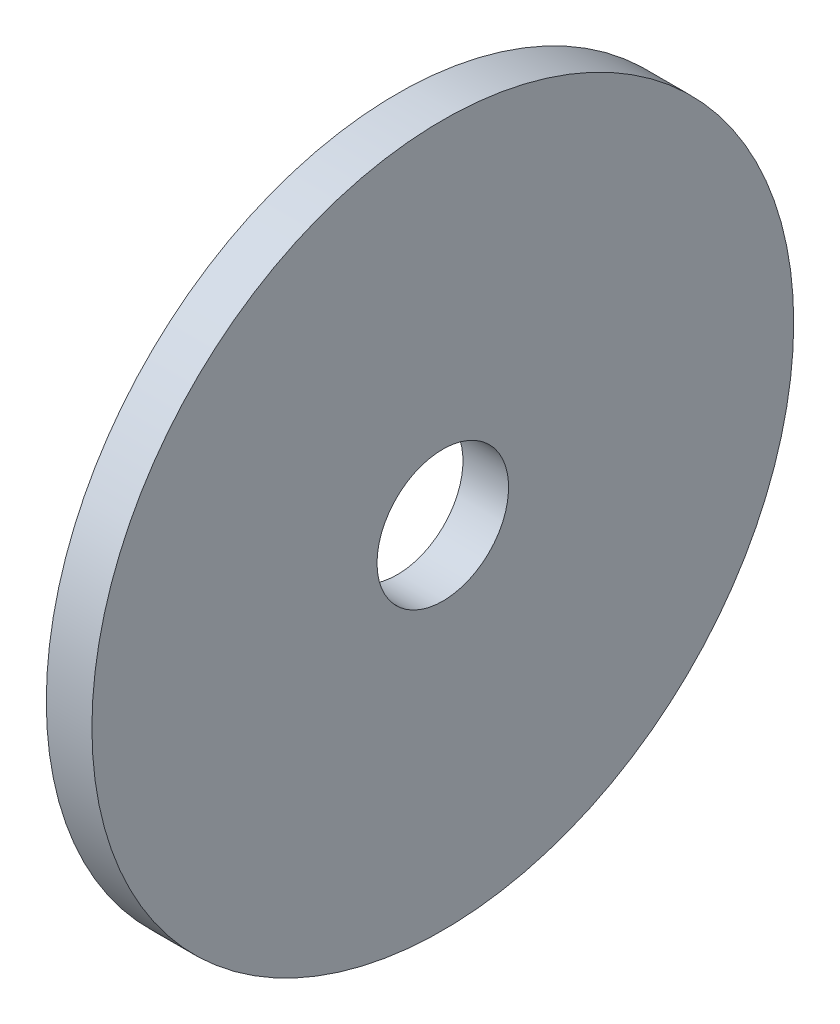
ISO-10303-21;
HEADER;
FILE_DESCRIPTION(('STEP AP214'),'2;1');
FILE_NAME('part.step','',(''),(''),'','','');
FILE_SCHEMA(('AUTOMOTIVE_DESIGN { 1 0 10303 214 1 1 1 1 }'));
ENDSEC;
DATA;
#1=APPLICATION_CONTEXT('core data for automotive mechanical design processes');
#2=APPLICATION_PROTOCOL_DEFINITION('international standard','automotive_design',2000,#1);
#3=PRODUCT_CONTEXT('',#1,'mechanical');
#4=PRODUCT('Part','Part','',(#3));
#5=PRODUCT_RELATED_PRODUCT_CATEGORY('part','',(#4));
#6=PRODUCT_DEFINITION_FORMATION('','',#4);
#7=PRODUCT_DEFINITION_CONTEXT('part definition',#1,'design');
#8=PRODUCT_DEFINITION('design','',#6,#7);
#9=PRODUCT_DEFINITION_SHAPE('','',#8);
#10=(LENGTH_UNIT() NAMED_UNIT(*) SI_UNIT(.MILLI.,.METRE.));
#11=(NAMED_UNIT(*) PLANE_ANGLE_UNIT() SI_UNIT($,.RADIAN.));
#12=(NAMED_UNIT(*) SI_UNIT($,.STERADIAN.) SOLID_ANGLE_UNIT());
#13=UNCERTAINTY_MEASURE_WITH_UNIT(LENGTH_MEASURE(1.E-05),#10,'distance_accuracy_value','');
#14=(GEOMETRIC_REPRESENTATION_CONTEXT(3) GLOBAL_UNCERTAINTY_ASSIGNED_CONTEXT((#13)) GLOBAL_UNIT_ASSIGNED_CONTEXT((#10,
#11,#12)) REPRESENTATION_CONTEXT('',''));
#15=CARTESIAN_POINT('',(0.,0.,0.));
#16=DIRECTION('',(0.,0.,1.));
#17=DIRECTION('',(1.,0.,0.));
#18=AXIS2_PLACEMENT_3D('',#15,#16,#17);
#19=CARTESIAN_POINT('',(1.651,0.,0.));
#20=DIRECTION('',(1.,0.,0.));
#21=DIRECTION('',(0.,0.,-1.));
#22=AXIS2_PLACEMENT_3D('',#19,#20,#21);
#23=PLANE('',#22);
#24=CARTESIAN_POINT('',(1.651,0.,0.));
#25=DIRECTION('',(1.,0.,0.));
#26=DIRECTION('',(0.,0.,-1.));
#27=AXIS2_PLACEMENT_3D('',#24,#25,#26);
#28=CIRCLE('',#27,12.7);
#29=CARTESIAN_POINT('',(1.651,0.,12.7));
#30=VERTEX_POINT('',#29);
#31=EDGE_CURVE('E10',#30,#30,#28,.T.);
#32=ORIENTED_EDGE('',*,*,#31,.T.);
#33=EDGE_LOOP('',(#32));
#34=FACE_BOUND('',#33,.T.);
#35=CARTESIAN_POINT('',(1.651,0.,0.));
#36=DIRECTION('',(1.,0.,0.));
#37=DIRECTION('',(0.,0.,-1.));
#38=AXIS2_PLACEMENT_3D('',#35,#36,#37);
#39=CIRCLE('',#38,2.38125);
#40=CARTESIAN_POINT('',(1.651,0.,2.38125));
#41=VERTEX_POINT('',#40);
#42=EDGE_CURVE('E41',#41,#41,#39,.T.);
#43=ORIENTED_EDGE('',*,*,#42,.F.);
#44=EDGE_LOOP('',(#43));
#45=FACE_BOUND('',#44,.T.);
#46=ADVANCED_FACE('F30',(#34,#45),#23,.T.);
#47=CARTESIAN_POINT('',(0.,0.,0.));
#48=DIRECTION('',(1.,0.,0.));
#49=DIRECTION('',(0.,0.,-1.));
#50=AXIS2_PLACEMENT_3D('',#47,#48,#49);
#51=PLANE('',#50);
#52=CARTESIAN_POINT('',(0.,0.,0.));
#53=DIRECTION('',(1.,0.,0.));
#54=DIRECTION('',(0.,0.,-1.));
#55=AXIS2_PLACEMENT_3D('',#52,#53,#54);
#56=CIRCLE('',#55,12.7);
#57=CARTESIAN_POINT('',(0.,0.,12.7));
#58=VERTEX_POINT('',#57);
#59=EDGE_CURVE('E34',#58,#58,#56,.T.);
#60=ORIENTED_EDGE('',*,*,#59,.F.);
#61=EDGE_LOOP('',(#60));
#62=FACE_BOUND('',#61,.T.);
#63=CARTESIAN_POINT('',(0.,0.,0.));
#64=DIRECTION('',(1.,0.,0.));
#65=DIRECTION('',(0.,0.,-1.));
#66=AXIS2_PLACEMENT_3D('',#63,#64,#65);
#67=CIRCLE('',#66,2.38125);
#68=CARTESIAN_POINT('',(0.,0.,2.38125));
#69=VERTEX_POINT('',#68);
#70=EDGE_CURVE('E43',#69,#69,#67,.T.);
#71=ORIENTED_EDGE('',*,*,#70,.T.);
#72=EDGE_LOOP('',(#71));
#73=FACE_BOUND('',#72,.T.);
#74=ADVANCED_FACE('F53',(#62,#73),#51,.F.);
#75=CARTESIAN_POINT('',(1.651,0.,0.));
#76=DIRECTION('',(-1.,0.,0.));
#77=DIRECTION('',(0.,0.,1.));
#78=AXIS2_PLACEMENT_3D('',#75,#76,#77);
#79=CYLINDRICAL_SURFACE('',#78,12.7);
#80=CARTESIAN_POINT('',(1.651,0.,12.7));
#81=CARTESIAN_POINT('',(1.63380208333333,0.,12.7));
#82=CARTESIAN_POINT('',(1.61660416666667,0.,12.7));
#83=CARTESIAN_POINT('',(1.58220833333333,0.,12.7));
#84=CARTESIAN_POINT('',(1.56501041666667,0.,12.7));
#85=CARTESIAN_POINT('',(1.53061458333333,0.,12.7));
#86=CARTESIAN_POINT('',(1.51341666666667,0.,12.7));
#87=CARTESIAN_POINT('',(1.47902083333333,0.,12.7));
#88=CARTESIAN_POINT('',(1.46182291666667,0.,12.7));
#89=CARTESIAN_POINT('',(1.42742708333333,0.,12.7));
#90=CARTESIAN_POINT('',(1.41022916666667,0.,12.7));
#91=CARTESIAN_POINT('',(1.37583333333333,0.,12.7));
#92=CARTESIAN_POINT('',(1.35863541666667,0.,12.7));
#93=CARTESIAN_POINT('',(1.32423958333333,0.,12.7));
#94=CARTESIAN_POINT('',(1.30704166666667,0.,12.7));
#95=CARTESIAN_POINT('',(1.27264583333333,0.,12.7));
#96=CARTESIAN_POINT('',(1.25544791666667,0.,12.7));
#97=CARTESIAN_POINT('',(1.22105208333333,0.,12.7));
#98=CARTESIAN_POINT('',(1.20385416666667,0.,12.7));
#99=CARTESIAN_POINT('',(1.16945833333333,0.,12.7));
#100=CARTESIAN_POINT('',(1.15226041666667,0.,12.7));
#101=CARTESIAN_POINT('',(1.11786458333333,0.,12.7));
#102=CARTESIAN_POINT('',(1.10066666666667,0.,12.7));
#103=CARTESIAN_POINT('',(1.06627083333333,0.,12.7));
#104=CARTESIAN_POINT('',(1.04907291666667,0.,12.7));
#105=CARTESIAN_POINT('',(1.01467708333333,0.,12.7));
#106=CARTESIAN_POINT('',(0.997479166666666,0.,12.7));
#107=CARTESIAN_POINT('',(0.963083333333333,0.,12.7));
#108=CARTESIAN_POINT('',(0.945885416666666,0.,12.7));
#109=CARTESIAN_POINT('',(0.911489583333333,0.,12.7));
#110=CARTESIAN_POINT('',(0.894291666666666,0.,12.7));
#111=CARTESIAN_POINT('',(0.859895833333333,0.,12.7));
#112=CARTESIAN_POINT('',(0.842697916666666,0.,12.7));
#113=CARTESIAN_POINT('',(0.808302083333333,0.,12.7));
#114=CARTESIAN_POINT('',(0.791104166666666,0.,12.7));
#115=CARTESIAN_POINT('',(0.756708333333333,0.,12.7));
#116=CARTESIAN_POINT('',(0.739510416666667,0.,12.7));
#117=CARTESIAN_POINT('',(0.705114583333333,0.,12.7));
#118=CARTESIAN_POINT('',(0.687916666666667,0.,12.7));
#119=CARTESIAN_POINT('',(0.653520833333333,0.,12.7));
#120=CARTESIAN_POINT('',(0.636322916666667,0.,12.7));
#121=CARTESIAN_POINT('',(0.601927083333333,0.,12.7));
#122=CARTESIAN_POINT('',(0.584729166666667,0.,12.7));
#123=CARTESIAN_POINT('',(0.550333333333333,0.,12.7));
#124=CARTESIAN_POINT('',(0.533135416666667,0.,12.7));
#125=CARTESIAN_POINT('',(0.498739583333333,0.,12.7));
#126=CARTESIAN_POINT('',(0.481541666666667,0.,12.7));
#127=CARTESIAN_POINT('',(0.447145833333333,0.,12.7));
#128=CARTESIAN_POINT('',(0.429947916666667,0.,12.7));
#129=CARTESIAN_POINT('',(0.395552083333333,0.,12.7));
#130=CARTESIAN_POINT('',(0.378354166666667,0.,12.7));
#131=CARTESIAN_POINT('',(0.343958333333333,0.,12.7));
#132=CARTESIAN_POINT('',(0.326760416666667,0.,12.7));
#133=CARTESIAN_POINT('',(0.292364583333333,0.,12.7));
#134=CARTESIAN_POINT('',(0.275166666666667,0.,12.7));
#135=CARTESIAN_POINT('',(0.240770833333333,0.,12.7));
#136=CARTESIAN_POINT('',(0.223572916666667,0.,12.7));
#137=CARTESIAN_POINT('',(0.189177083333333,0.,12.7));
#138=CARTESIAN_POINT('',(0.171979166666667,0.,12.7));
#139=CARTESIAN_POINT('',(0.137583333333333,0.,12.7));
#140=CARTESIAN_POINT('',(0.120385416666667,0.,12.7));
#141=CARTESIAN_POINT('',(0.0859895833333333,0.,12.7));
#142=CARTESIAN_POINT('',(0.0687916666666667,0.,12.7));
#143=CARTESIAN_POINT('',(0.0343958333333333,0.,12.7));
#144=CARTESIAN_POINT('',(0.0171979166666666,0.,12.7));
#145=CARTESIAN_POINT('',(0.,0.,12.7));
#146=B_SPLINE_CURVE_WITH_KNOTS('',3,(#80,#81,#82,#83,#84,#85,#86,#87,#88,#89,#90,#91,#92,#93,
#94,#95,#96,#97,#98,#99,#100,#101,#102,#103,#104,#105,#106,#107,#108,#109,#110,#111,#112,#113,
#114,#115,#116,#117,#118,#119,#120,#121,#122,#123,#124,#125,#126,#127,#128,#129,#130,#131,#132,
#133,#134,#135,#136,#137,#138,#139,#140,#141,#142,#143,#144,#145),.UNSPECIFIED.,.F.,.F.,(4,2,2,
2,2,2,2,2,2,2,2,2,2,2,2,2,2,2,2,2,2,2,2,2,2,2,2,2,2,2,2,2,4),(0.,0.0515937500000002,0.1031875,
0.15478125,0.206375,0.25796875,0.3095625,0.36115625,0.41275,0.46434375,0.5159375,0.56753125,
0.619125,0.67071875,0.7223125,0.77390625,0.8255,0.87709375,0.9286875,0.98028125,1.031875,
1.08346875,1.1350625,1.18665625,1.23825,1.28984375,1.3414375,1.39303125,1.444625,1.49621875,
1.5478125,1.59940625,1.651),.UNSPECIFIED.);
#147=EDGE_CURVE('BSEAM32',#30,#58,#146,.T.);
#148=ORIENTED_EDGE('',*,*,#31,.F.);
#149=ORIENTED_EDGE('',*,*,#59,.T.);
#150=ORIENTED_EDGE('',*,*,#147,.T.);
#151=ORIENTED_EDGE('',*,*,#147,.F.);
#152=EDGE_LOOP('',(#148,#150,#149,#151));
#153=FACE_BOUND('',#152,.T.);
#154=ADVANCED_FACE('F32',(#153),#79,.T.);
#155=CARTESIAN_POINT('',(1.651,0.,0.));
#156=DIRECTION('',(-1.,0.,0.));
#157=DIRECTION('',(0.,0.,1.));
#158=AXIS2_PLACEMENT_3D('',#155,#156,#157);
#159=CYLINDRICAL_SURFACE('',#158,2.38125);
#160=CARTESIAN_POINT('',(1.651,0.,2.38125));
#161=CARTESIAN_POINT('',(1.63380208333333,0.,2.38125));
#162=CARTESIAN_POINT('',(1.61660416666667,0.,2.38125));
#163=CARTESIAN_POINT('',(1.58220833333333,0.,2.38125));
#164=CARTESIAN_POINT('',(1.56501041666667,0.,2.38125));
#165=CARTESIAN_POINT('',(1.53061458333333,0.,2.38125));
#166=CARTESIAN_POINT('',(1.51341666666667,0.,2.38125));
#167=CARTESIAN_POINT('',(1.47902083333333,0.,2.38125));
#168=CARTESIAN_POINT('',(1.46182291666667,0.,2.38125));
#169=CARTESIAN_POINT('',(1.42742708333333,0.,2.38125));
#170=CARTESIAN_POINT('',(1.41022916666667,0.,2.38125));
#171=CARTESIAN_POINT('',(1.37583333333333,0.,2.38125));
#172=CARTESIAN_POINT('',(1.35863541666667,0.,2.38125));
#173=CARTESIAN_POINT('',(1.32423958333333,0.,2.38125));
#174=CARTESIAN_POINT('',(1.30704166666667,0.,2.38125));
#175=CARTESIAN_POINT('',(1.27264583333333,0.,2.38125));
#176=CARTESIAN_POINT('',(1.25544791666667,0.,2.38125));
#177=CARTESIAN_POINT('',(1.22105208333333,0.,2.38125));
#178=CARTESIAN_POINT('',(1.20385416666667,0.,2.38125));
#179=CARTESIAN_POINT('',(1.16945833333333,0.,2.38125));
#180=CARTESIAN_POINT('',(1.15226041666667,0.,2.38125));
#181=CARTESIAN_POINT('',(1.11786458333333,0.,2.38125));
#182=CARTESIAN_POINT('',(1.10066666666667,0.,2.38125));
#183=CARTESIAN_POINT('',(1.06627083333333,0.,2.38125));
#184=CARTESIAN_POINT('',(1.04907291666667,0.,2.38125));
#185=CARTESIAN_POINT('',(1.01467708333333,0.,2.38125));
#186=CARTESIAN_POINT('',(0.997479166666666,0.,2.38125));
#187=CARTESIAN_POINT('',(0.963083333333333,0.,2.38125));
#188=CARTESIAN_POINT('',(0.945885416666666,0.,2.38125));
#189=CARTESIAN_POINT('',(0.911489583333333,0.,2.38125));
#190=CARTESIAN_POINT('',(0.894291666666666,0.,2.38125));
#191=CARTESIAN_POINT('',(0.859895833333333,0.,2.38125));
#192=CARTESIAN_POINT('',(0.842697916666666,0.,2.38125));
#193=CARTESIAN_POINT('',(0.808302083333333,0.,2.38125));
#194=CARTESIAN_POINT('',(0.791104166666666,0.,2.38125));
#195=CARTESIAN_POINT('',(0.756708333333333,0.,2.38125));
#196=CARTESIAN_POINT('',(0.739510416666667,0.,2.38125));
#197=CARTESIAN_POINT('',(0.705114583333333,0.,2.38125));
#198=CARTESIAN_POINT('',(0.687916666666667,0.,2.38125));
#199=CARTESIAN_POINT('',(0.653520833333333,0.,2.38125));
#200=CARTESIAN_POINT('',(0.636322916666667,0.,2.38125));
#201=CARTESIAN_POINT('',(0.601927083333333,0.,2.38125));
#202=CARTESIAN_POINT('',(0.584729166666667,0.,2.38125));
#203=CARTESIAN_POINT('',(0.550333333333333,0.,2.38125));
#204=CARTESIAN_POINT('',(0.533135416666667,0.,2.38125));
#205=CARTESIAN_POINT('',(0.498739583333333,0.,2.38125));
#206=CARTESIAN_POINT('',(0.481541666666667,0.,2.38125));
#207=CARTESIAN_POINT('',(0.447145833333333,0.,2.38125));
#208=CARTESIAN_POINT('',(0.429947916666667,0.,2.38125));
#209=CARTESIAN_POINT('',(0.395552083333333,0.,2.38125));
#210=CARTESIAN_POINT('',(0.378354166666667,0.,2.38125));
#211=CARTESIAN_POINT('',(0.343958333333333,0.,2.38125));
#212=CARTESIAN_POINT('',(0.326760416666667,0.,2.38125));
#213=CARTESIAN_POINT('',(0.292364583333333,0.,2.38125));
#214=CARTESIAN_POINT('',(0.275166666666667,0.,2.38125));
#215=CARTESIAN_POINT('',(0.240770833333333,0.,2.38125));
#216=CARTESIAN_POINT('',(0.223572916666667,0.,2.38125));
#217=CARTESIAN_POINT('',(0.189177083333333,0.,2.38125));
#218=CARTESIAN_POINT('',(0.171979166666667,0.,2.38125));
#219=CARTESIAN_POINT('',(0.137583333333333,0.,2.38125));
#220=CARTESIAN_POINT('',(0.120385416666667,0.,2.38125));
#221=CARTESIAN_POINT('',(0.0859895833333333,0.,2.38125));
#222=CARTESIAN_POINT('',(0.0687916666666667,0.,2.38125));
#223=CARTESIAN_POINT('',(0.0343958333333333,0.,2.38125));
#224=CARTESIAN_POINT('',(0.0171979166666666,0.,2.38125));
#225=CARTESIAN_POINT('',(0.,0.,2.38125));
#226=B_SPLINE_CURVE_WITH_KNOTS('',3,(#160,#161,#162,#163,#164,#165,#166,#167,#168,#169,#170,
#171,#172,#173,#174,#175,#176,#177,#178,#179,#180,#181,#182,#183,#184,#185,#186,#187,#188,#189,
#190,#191,#192,#193,#194,#195,#196,#197,#198,#199,#200,#201,#202,#203,#204,#205,#206,#207,#208,
#209,#210,#211,#212,#213,#214,#215,#216,#217,#218,#219,#220,#221,#222,#223,#224,#225),
.UNSPECIFIED.,.F.,.F.,(4,2,2,2,2,2,2,2,2,2,2,2,2,2,2,2,2,2,2,2,2,2,2,2,2,2,2,2,2,2,2,2,4),(0.,
0.0515937500000002,0.1031875,0.15478125,0.206375,0.25796875,0.3095625,0.36115625,0.41275,
0.46434375,0.5159375,0.56753125,0.619125,0.67071875,0.7223125,0.77390625,0.8255,0.87709375,
0.9286875,0.98028125,1.031875,1.08346875,1.1350625,1.18665625,1.23825,1.28984375,1.3414375,
1.39303125,1.444625,1.49621875,1.5478125,1.59940625,1.651),.UNSPECIFIED.);
#227=EDGE_CURVE('BSEAM49',#41,#69,#226,.T.);
#228=ORIENTED_EDGE('',*,*,#42,.T.);
#229=ORIENTED_EDGE('',*,*,#70,.F.);
#230=ORIENTED_EDGE('',*,*,#227,.T.);
#231=ORIENTED_EDGE('',*,*,#227,.F.);
#232=EDGE_LOOP('',(#228,#230,#229,#231));
#233=FACE_BOUND('',#232,.T.);
#234=ADVANCED_FACE('F49',(#233),#159,.F.);
#235=CLOSED_SHELL('',(#46,#74,#154,#234));
#236=MANIFOLD_SOLID_BREP('B2',#235);
#237=ADVANCED_BREP_SHAPE_REPRESENTATION('',(#18,#236),#14);
#238=SHAPE_DEFINITION_REPRESENTATION(#9,#237);
ENDSEC;
END-ISO-10303-21;
